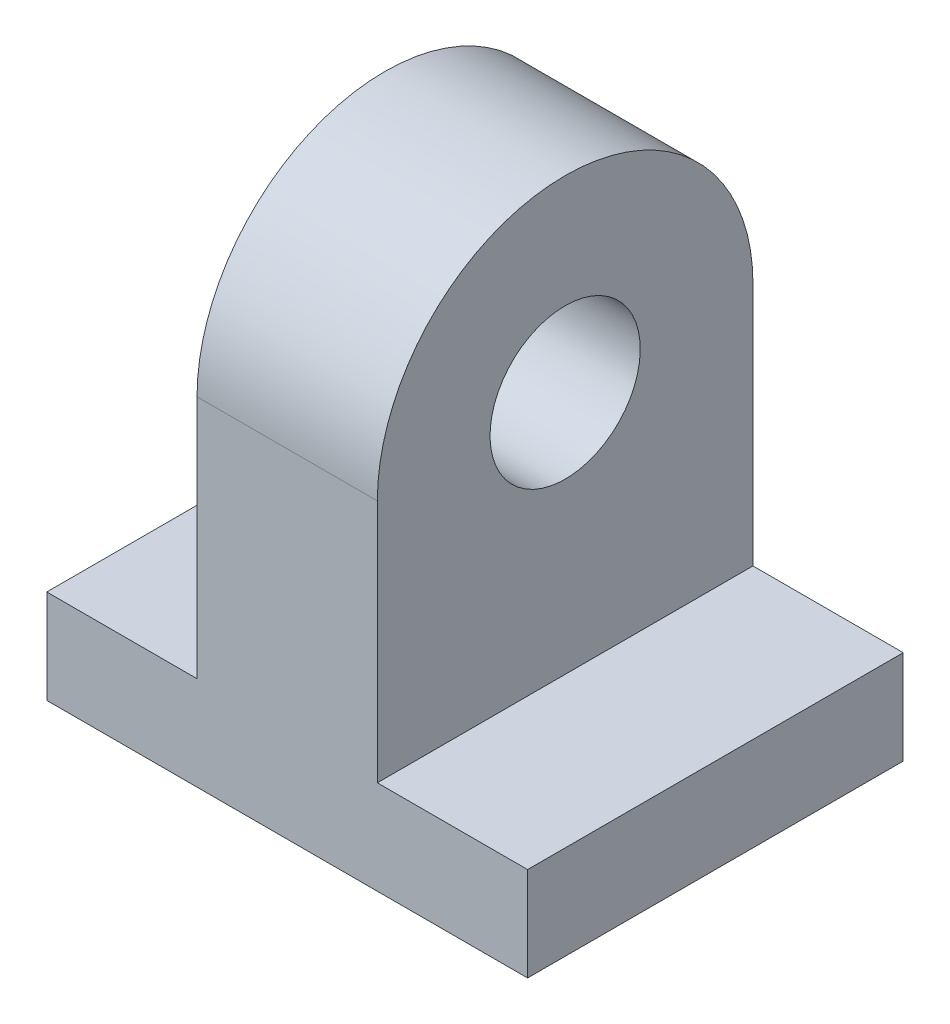
ISO-10303-21;
HEADER;
FILE_DESCRIPTION(('STEP AP214'),'2;1');
FILE_NAME('part.step','',(''),(''),'','','');
FILE_SCHEMA(('AUTOMOTIVE_DESIGN { 1 0 10303 214 1 1 1 1 }'));
ENDSEC;
DATA;
#1=APPLICATION_CONTEXT('core data for automotive mechanical design processes');
#2=APPLICATION_PROTOCOL_DEFINITION('international standard','automotive_design',2000,#1);
#3=PRODUCT_CONTEXT('',#1,'mechanical');
#4=PRODUCT('Part','Part','',(#3));
#5=PRODUCT_RELATED_PRODUCT_CATEGORY('part','',(#4));
#6=PRODUCT_DEFINITION_FORMATION('','',#4);
#7=PRODUCT_DEFINITION_CONTEXT('part definition',#1,'design');
#8=PRODUCT_DEFINITION('design','',#6,#7);
#9=PRODUCT_DEFINITION_SHAPE('','',#8);
#10=(LENGTH_UNIT() NAMED_UNIT(*) SI_UNIT(.MILLI.,.METRE.));
#11=(NAMED_UNIT(*) PLANE_ANGLE_UNIT() SI_UNIT($,.RADIAN.));
#12=(NAMED_UNIT(*) SI_UNIT($,.STERADIAN.) SOLID_ANGLE_UNIT());
#13=UNCERTAINTY_MEASURE_WITH_UNIT(LENGTH_MEASURE(1.E-05),#10,'distance_accuracy_value','');
#14=(GEOMETRIC_REPRESENTATION_CONTEXT(3) GLOBAL_UNCERTAINTY_ASSIGNED_CONTEXT((#13)) GLOBAL_UNIT_ASSIGNED_CONTEXT((#10,
#11,#12)) REPRESENTATION_CONTEXT('',''));
#15=CARTESIAN_POINT('',(0.,0.,0.));
#16=DIRECTION('',(0.,0.,1.));
#17=DIRECTION('',(1.,0.,0.));
#18=AXIS2_PLACEMENT_3D('',#15,#16,#17);
#19=CARTESIAN_POINT('',(2.4,2.5,10.));
#20=DIRECTION('',(-1.,0.,0.));
#21=DIRECTION('',(0.,-1.,0.));
#22=AXIS2_PLACEMENT_3D('',#19,#20,#21);
#23=PLANE('',#22);
#24=CARTESIAN_POINT('',(2.4,9.,5.));
#25=DIRECTION('',(1.,0.,0.));
#26=DIRECTION('',(0.,1.,0.));
#27=AXIS2_PLACEMENT_3D('',#24,#25,#26);
#28=CIRCLE('',#27,2.);
#29=CARTESIAN_POINT('',(2.4,11.,5.));
#30=VERTEX_POINT('',#29);
#31=EDGE_CURVE('E158',#30,#30,#28,.T.);
#32=ORIENTED_EDGE('',*,*,#31,.F.);
#33=EDGE_LOOP('',(#32));
#34=FACE_BOUND('',#33,.T.);
#35=CARTESIAN_POINT('',(2.4,9.,5.));
#36=DIRECTION('',(1.,0.,0.));
#37=DIRECTION('',(0.,1.,0.));
#38=AXIS2_PLACEMENT_3D('',#35,#36,#37);
#39=CIRCLE('',#38,5.);
#40=CARTESIAN_POINT('',(2.4,9.,0.));
#41=VERTEX_POINT('',#40);
#42=CARTESIAN_POINT('',(2.4,9.,10.));
#43=VERTEX_POINT('',#42);
#44=EDGE_CURVE('E51',#41,#43,#39,.T.);
#45=ORIENTED_EDGE('',*,*,#44,.T.);
#46=DIRECTION('',(0.,1.,0.));
#47=VECTOR('',#46,1.);
#48=CARTESIAN_POINT('',(2.4,2.5,10.));
#49=LINE('',#48,#47);
#50=CARTESIAN_POINT('',(2.4,2.5,10.));
#51=VERTEX_POINT('',#50);
#52=EDGE_CURVE('E111',#51,#43,#49,.T.);
#53=ORIENTED_EDGE('',*,*,#52,.F.);
#54=DIRECTION('',(0.,0.,-1.));
#55=VECTOR('',#54,1.);
#56=CARTESIAN_POINT('',(2.4,2.5,10.));
#57=LINE('',#56,#55);
#58=CARTESIAN_POINT('',(2.4,2.5,0.));
#59=VERTEX_POINT('',#58);
#60=EDGE_CURVE('E119',#51,#59,#57,.T.);
#61=ORIENTED_EDGE('',*,*,#60,.T.);
#62=DIRECTION('',(0.,1.,0.));
#63=VECTOR('',#62,1.);
#64=CARTESIAN_POINT('',(2.4,2.5,0.));
#65=LINE('',#64,#63);
#66=EDGE_CURVE('E145',#59,#41,#65,.T.);
#67=ORIENTED_EDGE('',*,*,#66,.T.);
#68=EDGE_LOOP('',(#45,#53,#61,#67));
#69=FACE_BOUND('',#68,.T.);
#70=ADVANCED_FACE('F36',(#34,#69),#23,.F.);
#71=CARTESIAN_POINT('',(-2.4,14.,10.));
#72=DIRECTION('',(1.,0.,0.));
#73=DIRECTION('',(0.,1.,0.));
#74=AXIS2_PLACEMENT_3D('',#71,#72,#73);
#75=PLANE('',#74);
#76=CARTESIAN_POINT('',(-2.4,9.,5.));
#77=DIRECTION('',(1.,0.,0.));
#78=DIRECTION('',(0.,1.,0.));
#79=AXIS2_PLACEMENT_3D('',#76,#77,#78);
#80=CIRCLE('',#79,2.);
#81=CARTESIAN_POINT('',(-2.4,11.,5.));
#82=VERTEX_POINT('',#81);
#83=EDGE_CURVE('E140',#82,#82,#80,.T.);
#84=ORIENTED_EDGE('',*,*,#83,.T.);
#85=EDGE_LOOP('',(#84));
#86=FACE_BOUND('',#85,.T.);
#87=DIRECTION('',(0.,-1.,0.));
#88=VECTOR('',#87,1.);
#89=CARTESIAN_POINT('',(-2.4,14.,10.));
#90=LINE('',#89,#88);
#91=CARTESIAN_POINT('',(-2.4,9.,10.));
#92=VERTEX_POINT('',#91);
#93=CARTESIAN_POINT('',(-2.4,2.5,10.));
#94=VERTEX_POINT('',#93);
#95=EDGE_CURVE('E129',#92,#94,#90,.T.);
#96=ORIENTED_EDGE('',*,*,#95,.F.);
#97=CARTESIAN_POINT('',(-2.4,9.,5.));
#98=DIRECTION('',(1.,0.,0.));
#99=DIRECTION('',(0.,1.,0.));
#100=AXIS2_PLACEMENT_3D('',#97,#98,#99);
#101=CIRCLE('',#100,5.);
#102=CARTESIAN_POINT('',(-2.4,9.,0.));
#103=VERTEX_POINT('',#102);
#104=EDGE_CURVE('E162',#103,#92,#101,.T.);
#105=ORIENTED_EDGE('',*,*,#104,.F.);
#106=DIRECTION('',(0.,-1.,0.));
#107=VECTOR('',#106,1.);
#108=CARTESIAN_POINT('',(-2.4,14.,0.));
#109=LINE('',#108,#107);
#110=CARTESIAN_POINT('',(-2.4,2.5,0.));
#111=VERTEX_POINT('',#110);
#112=EDGE_CURVE('E147',#103,#111,#109,.T.);
#113=ORIENTED_EDGE('',*,*,#112,.T.);
#114=DIRECTION('',(0.,0.,-1.));
#115=VECTOR('',#114,1.);
#116=CARTESIAN_POINT('',(-2.4,2.5,10.));
#117=LINE('',#116,#115);
#118=EDGE_CURVE('E127',#94,#111,#117,.T.);
#119=ORIENTED_EDGE('',*,*,#118,.F.);
#120=EDGE_LOOP('',(#96,#105,#113,#119));
#121=FACE_BOUND('',#120,.T.);
#122=ADVANCED_FACE('F186',(#86,#121),#75,.F.);
#123=CARTESIAN_POINT('',(-6.4,2.5,10.));
#124=DIRECTION('',(1.,0.,0.));
#125=DIRECTION('',(0.,0.,-1.));
#126=AXIS2_PLACEMENT_3D('',#123,#124,#125);
#127=PLANE('',#126);
#128=DIRECTION('',(0.,-1.,0.));
#129=VECTOR('',#128,1.);
#130=CARTESIAN_POINT('',(-6.4,2.5,0.));
#131=LINE('',#130,#129);
#132=CARTESIAN_POINT('',(-6.4,2.5,0.));
#133=VERTEX_POINT('',#132);
#134=CARTESIAN_POINT('',(-6.4,0.,0.));
#135=VERTEX_POINT('',#134);
#136=EDGE_CURVE('E136',#133,#135,#131,.T.);
#137=ORIENTED_EDGE('',*,*,#136,.T.);
#138=DIRECTION('',(0.,0.,-1.));
#139=VECTOR('',#138,1.);
#140=CARTESIAN_POINT('',(-6.4,0.,10.));
#141=LINE('',#140,#139);
#142=CARTESIAN_POINT('',(-6.4,0.,10.));
#143=VERTEX_POINT('',#142);
#144=EDGE_CURVE('E44',#143,#135,#141,.T.);
#145=ORIENTED_EDGE('',*,*,#144,.F.);
#146=DIRECTION('',(0.,-1.,0.));
#147=VECTOR('',#146,1.);
#148=CARTESIAN_POINT('',(-6.4,2.5,10.));
#149=LINE('',#148,#147);
#150=CARTESIAN_POINT('',(-6.4,2.5,10.));
#151=VERTEX_POINT('',#150);
#152=EDGE_CURVE('E150',#151,#143,#149,.T.);
#153=ORIENTED_EDGE('',*,*,#152,.F.);
#154=DIRECTION('',(0.,0.,-1.));
#155=VECTOR('',#154,1.);
#156=CARTESIAN_POINT('',(-6.4,2.5,10.));
#157=LINE('',#156,#155);
#158=EDGE_CURVE('E135',#151,#133,#157,.T.);
#159=ORIENTED_EDGE('',*,*,#158,.T.);
#160=EDGE_LOOP('',(#137,#145,#153,#159));
#161=FACE_BOUND('',#160,.T.);
#162=ADVANCED_FACE('F38',(#161),#127,.F.);
#163=CARTESIAN_POINT('',(-6.4,0.,10.));
#164=DIRECTION('',(0.,1.,0.));
#165=DIRECTION('',(0.,0.,1.));
#166=AXIS2_PLACEMENT_3D('',#163,#164,#165);
#167=PLANE('',#166);
#168=DIRECTION('',(0.,0.,-1.));
#169=VECTOR('',#168,1.);
#170=CARTESIAN_POINT('',(6.4,0.,10.));
#171=LINE('',#170,#169);
#172=CARTESIAN_POINT('',(6.4,0.,10.));
#173=VERTEX_POINT('',#172);
#174=CARTESIAN_POINT('',(6.4,0.,0.));
#175=VERTEX_POINT('',#174);
#176=EDGE_CURVE('E154',#173,#175,#171,.T.);
#177=ORIENTED_EDGE('',*,*,#176,.F.);
#178=DIRECTION('',(1.,0.,0.));
#179=VECTOR('',#178,1.);
#180=CARTESIAN_POINT('',(-6.4,0.,10.));
#181=LINE('',#180,#179);
#182=EDGE_CURVE('E95',#143,#173,#181,.T.);
#183=ORIENTED_EDGE('',*,*,#182,.F.);
#184=ORIENTED_EDGE('',*,*,#144,.T.);
#185=DIRECTION('',(1.,0.,0.));
#186=VECTOR('',#185,1.);
#187=CARTESIAN_POINT('',(-6.4,0.,0.));
#188=LINE('',#187,#186);
#189=EDGE_CURVE('E139',#135,#175,#188,.T.);
#190=ORIENTED_EDGE('',*,*,#189,.T.);
#191=EDGE_LOOP('',(#177,#183,#184,#190));
#192=FACE_BOUND('',#191,.T.);
#193=ADVANCED_FACE('F174',(#192),#167,.F.);
#194=CARTESIAN_POINT('',(6.4,0.,10.));
#195=DIRECTION('',(-1.,0.,0.));
#196=DIRECTION('',(0.,0.,1.));
#197=AXIS2_PLACEMENT_3D('',#194,#195,#196);
#198=PLANE('',#197);
#199=DIRECTION('',(0.,1.,0.));
#200=VECTOR('',#199,1.);
#201=CARTESIAN_POINT('',(6.4,0.,0.));
#202=LINE('',#201,#200);
#203=CARTESIAN_POINT('',(6.4,2.5,0.));
#204=VERTEX_POINT('',#203);
#205=EDGE_CURVE('E142',#175,#204,#202,.T.);
#206=ORIENTED_EDGE('',*,*,#205,.T.);
#207=DIRECTION('',(0.,0.,-1.));
#208=VECTOR('',#207,1.);
#209=CARTESIAN_POINT('',(6.4,2.5,10.));
#210=LINE('',#209,#208);
#211=CARTESIAN_POINT('',(6.4,2.5,10.));
#212=VERTEX_POINT('',#211);
#213=EDGE_CURVE('E126',#212,#204,#210,.T.);
#214=ORIENTED_EDGE('',*,*,#213,.F.);
#215=DIRECTION('',(0.,1.,0.));
#216=VECTOR('',#215,1.);
#217=CARTESIAN_POINT('',(6.4,0.,10.));
#218=LINE('',#217,#216);
#219=EDGE_CURVE('E113',#173,#212,#218,.T.);
#220=ORIENTED_EDGE('',*,*,#219,.F.);
#221=ORIENTED_EDGE('',*,*,#176,.T.);
#222=EDGE_LOOP('',(#206,#214,#220,#221));
#223=FACE_BOUND('',#222,.T.);
#224=ADVANCED_FACE('F177',(#223),#198,.F.);
#225=CARTESIAN_POINT('',(6.4,2.5,10.));
#226=DIRECTION('',(0.,-1.,0.));
#227=DIRECTION('',(1.,0.,0.));
#228=AXIS2_PLACEMENT_3D('',#225,#226,#227);
#229=PLANE('',#228);
#230=DIRECTION('',(-1.,0.,0.));
#231=VECTOR('',#230,1.);
#232=CARTESIAN_POINT('',(6.4,2.5,0.));
#233=LINE('',#232,#231);
#234=EDGE_CURVE('E122',#204,#59,#233,.T.);
#235=ORIENTED_EDGE('',*,*,#234,.T.);
#236=ORIENTED_EDGE('',*,*,#60,.F.);
#237=DIRECTION('',(-1.,0.,0.));
#238=VECTOR('',#237,1.);
#239=CARTESIAN_POINT('',(6.4,2.5,10.));
#240=LINE('',#239,#238);
#241=EDGE_CURVE('E105',#212,#51,#240,.T.);
#242=ORIENTED_EDGE('',*,*,#241,.F.);
#243=ORIENTED_EDGE('',*,*,#213,.T.);
#244=EDGE_LOOP('',(#235,#236,#242,#243));
#245=FACE_BOUND('',#244,.T.);
#246=ADVANCED_FACE('F120',(#245),#229,.F.);
#247=CARTESIAN_POINT('',(-2.4,2.5,10.));
#248=DIRECTION('',(0.,-1.,0.));
#249=DIRECTION('',(1.,0.,0.));
#250=AXIS2_PLACEMENT_3D('',#247,#248,#249);
#251=PLANE('',#250);
#252=DIRECTION('',(-1.,0.,0.));
#253=VECTOR('',#252,1.);
#254=CARTESIAN_POINT('',(-2.4,2.5,0.));
#255=LINE('',#254,#253);
#256=EDGE_CURVE('E86',#111,#133,#255,.T.);
#257=ORIENTED_EDGE('',*,*,#256,.T.);
#258=ORIENTED_EDGE('',*,*,#158,.F.);
#259=DIRECTION('',(-1.,0.,0.));
#260=VECTOR('',#259,1.);
#261=CARTESIAN_POINT('',(-2.4,2.5,10.));
#262=LINE('',#261,#260);
#263=EDGE_CURVE('E59',#94,#151,#262,.T.);
#264=ORIENTED_EDGE('',*,*,#263,.F.);
#265=ORIENTED_EDGE('',*,*,#118,.T.);
#266=EDGE_LOOP('',(#257,#258,#264,#265));
#267=FACE_BOUND('',#266,.T.);
#268=ADVANCED_FACE('F190',(#267),#251,.F.);
#269=CARTESIAN_POINT('',(0.,0.,10.));
#270=DIRECTION('',(0.,0.,1.));
#271=DIRECTION('',(1.,0.,0.));
#272=AXIS2_PLACEMENT_3D('',#269,#270,#271);
#273=PLANE('',#272);
#274=ORIENTED_EDGE('',*,*,#241,.T.);
#275=ORIENTED_EDGE('',*,*,#52,.T.);
#276=DIRECTION('',(1.,0.,0.));
#277=VECTOR('',#276,1.);
#278=CARTESIAN_POINT('',(-6.4,8.99999999999999,10.));
#279=LINE('',#278,#277);
#280=EDGE_CURVE('E167',#92,#43,#279,.T.);
#281=ORIENTED_EDGE('',*,*,#280,.F.);
#282=ORIENTED_EDGE('',*,*,#95,.T.);
#283=ORIENTED_EDGE('',*,*,#263,.T.);
#284=ORIENTED_EDGE('',*,*,#152,.T.);
#285=ORIENTED_EDGE('',*,*,#182,.T.);
#286=ORIENTED_EDGE('',*,*,#219,.T.);
#287=EDGE_LOOP('',(#274,#275,#281,#282,#283,#284,#285,#286));
#288=FACE_BOUND('',#287,.T.);
#289=ADVANCED_FACE('F107',(#288),#273,.T.);
#290=CARTESIAN_POINT('',(0.,0.,0.));
#291=DIRECTION('',(0.,0.,1.));
#292=DIRECTION('',(1.,0.,0.));
#293=AXIS2_PLACEMENT_3D('',#290,#291,#292);
#294=PLANE('',#293);
#295=ORIENTED_EDGE('',*,*,#205,.F.);
#296=ORIENTED_EDGE('',*,*,#189,.F.);
#297=ORIENTED_EDGE('',*,*,#136,.F.);
#298=ORIENTED_EDGE('',*,*,#256,.F.);
#299=ORIENTED_EDGE('',*,*,#112,.F.);
#300=DIRECTION('',(1.,0.,0.));
#301=VECTOR('',#300,1.);
#302=CARTESIAN_POINT('',(-6.4,8.99999999999999,0.));
#303=LINE('',#302,#301);
#304=EDGE_CURVE('E12',#103,#41,#303,.T.);
#305=ORIENTED_EDGE('',*,*,#304,.T.);
#306=ORIENTED_EDGE('',*,*,#66,.F.);
#307=ORIENTED_EDGE('',*,*,#234,.F.);
#308=EDGE_LOOP('',(#295,#296,#297,#298,#299,#305,#306,#307));
#309=FACE_BOUND('',#308,.T.);
#310=ADVANCED_FACE('F179',(#309),#294,.F.);
#311=CARTESIAN_POINT('',(-6.4,8.99999999999999,5.));
#312=DIRECTION('',(1.,0.,0.));
#313=DIRECTION('',(0.,1.,0.));
#314=AXIS2_PLACEMENT_3D('',#311,#312,#313);
#315=CYLINDRICAL_SURFACE('',#314,2.);
#316=ORIENTED_EDGE('',*,*,#31,.T.);
#317=EDGE_LOOP('',(#316));
#318=FACE_BOUND('',#317,.T.);
#319=ORIENTED_EDGE('',*,*,#83,.F.);
#320=EDGE_LOOP('',(#319));
#321=FACE_BOUND('',#320,.T.);
#322=ADVANCED_FACE('F234',(#318,#321),#315,.F.);
#323=CARTESIAN_POINT('',(-6.4,8.99999999999999,5.));
#324=DIRECTION('',(1.,0.,0.));
#325=DIRECTION('',(0.,1.,0.));
#326=AXIS2_PLACEMENT_3D('',#323,#324,#325);
#327=CYLINDRICAL_SURFACE('',#326,5.);
#328=ORIENTED_EDGE('',*,*,#104,.T.);
#329=ORIENTED_EDGE('',*,*,#280,.T.);
#330=ORIENTED_EDGE('',*,*,#44,.F.);
#331=ORIENTED_EDGE('',*,*,#304,.F.);
#332=EDGE_LOOP('',(#328,#329,#330,#331));
#333=FACE_BOUND('',#332,.T.);
#334=ADVANCED_FACE('F182',(#333),#327,.T.);
#335=CLOSED_SHELL('',(#70,#122,#162,#193,#224,#246,#268,#289,#310,#322,#334));
#336=MANIFOLD_SOLID_BREP('B2',#335);
#337=ADVANCED_BREP_SHAPE_REPRESENTATION('',(#18,#336),#14);
#338=SHAPE_DEFINITION_REPRESENTATION(#9,#337);
ENDSEC;
END-ISO-10303-21;
